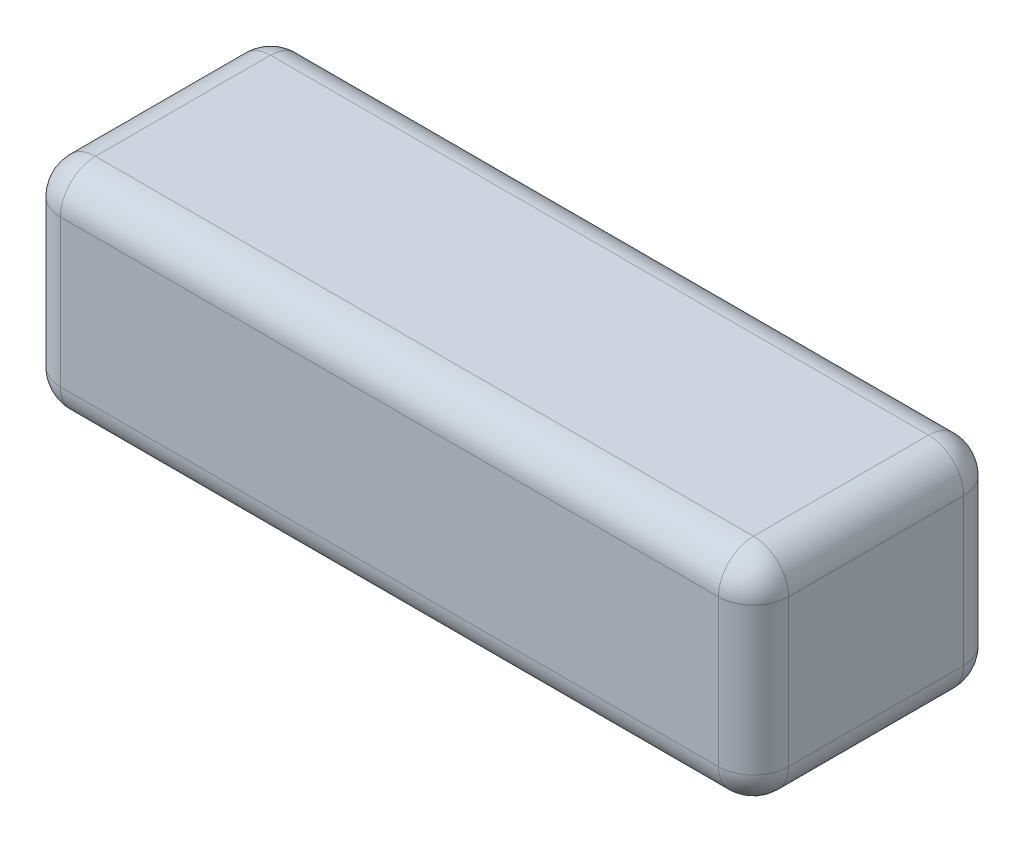
ISO-10303-21;
HEADER;
FILE_DESCRIPTION(('STEP AP214'),'2;1');
FILE_NAME('part.step','',(''),(''),'','','');
FILE_SCHEMA(('AUTOMOTIVE_DESIGN { 1 0 10303 214 1 1 1 1 }'));
ENDSEC;
DATA;
#1=APPLICATION_CONTEXT('core data for automotive mechanical design processes');
#2=APPLICATION_PROTOCOL_DEFINITION('international standard','automotive_design',2000,#1);
#3=PRODUCT_CONTEXT('',#1,'mechanical');
#4=PRODUCT('Part','Part','',(#3));
#5=PRODUCT_RELATED_PRODUCT_CATEGORY('part','',(#4));
#6=PRODUCT_DEFINITION_FORMATION('','',#4);
#7=PRODUCT_DEFINITION_CONTEXT('part definition',#1,'design');
#8=PRODUCT_DEFINITION('design','',#6,#7);
#9=PRODUCT_DEFINITION_SHAPE('','',#8);
#10=(LENGTH_UNIT() NAMED_UNIT(*) SI_UNIT(.MILLI.,.METRE.));
#11=(NAMED_UNIT(*) PLANE_ANGLE_UNIT() SI_UNIT($,.RADIAN.));
#12=(NAMED_UNIT(*) SI_UNIT($,.STERADIAN.) SOLID_ANGLE_UNIT());
#13=UNCERTAINTY_MEASURE_WITH_UNIT(LENGTH_MEASURE(1.E-05),#10,'distance_accuracy_value','');
#14=(GEOMETRIC_REPRESENTATION_CONTEXT(3) GLOBAL_UNCERTAINTY_ASSIGNED_CONTEXT((#13)) GLOBAL_UNIT_ASSIGNED_CONTEXT((#10,
#11,#12)) REPRESENTATION_CONTEXT('',''));
#15=CARTESIAN_POINT('',(0.,0.,0.));
#16=DIRECTION('',(0.,0.,1.));
#17=DIRECTION('',(1.,0.,0.));
#18=AXIS2_PLACEMENT_3D('',#15,#16,#17);
#19=CARTESIAN_POINT('',(51.975,31.,-17.5));
#20=DIRECTION('',(-1.,0.,0.));
#21=DIRECTION('',(0.,0.,1.));
#22=AXIS2_PLACEMENT_3D('',#19,#20,#21);
#23=PLANE('',#22);
#24=DIRECTION('',(0.,-1.,0.));
#25=VECTOR('',#24,1.);
#26=CARTESIAN_POINT('',(51.975,31.,12.5));
#27=LINE('',#26,#25);
#28=CARTESIAN_POINT('',(51.975,26.,12.5));
#29=VERTEX_POINT('',#28);
#30=CARTESIAN_POINT('',(51.975,5.,12.5));
#31=VERTEX_POINT('',#30);
#32=EDGE_CURVE('E278',#29,#31,#27,.T.);
#33=ORIENTED_EDGE('',*,*,#32,.T.);
#34=DIRECTION('',(0.,0.,-1.));
#35=VECTOR('',#34,1.);
#36=CARTESIAN_POINT('',(51.975,5.,-17.5));
#37=LINE('',#36,#35);
#38=CARTESIAN_POINT('',(51.975,5.,-12.5));
#39=VERTEX_POINT('',#38);
#40=EDGE_CURVE('E281',#31,#39,#37,.T.);
#41=ORIENTED_EDGE('',*,*,#40,.T.);
#42=DIRECTION('',(0.,-1.,0.));
#43=VECTOR('',#42,1.);
#44=CARTESIAN_POINT('',(51.975,31.,-12.5));
#45=LINE('',#44,#43);
#46=CARTESIAN_POINT('',(51.975,26.,-12.5));
#47=VERTEX_POINT('',#46);
#48=EDGE_CURVE('E213',#39,#47,#45,.F.);
#49=ORIENTED_EDGE('',*,*,#48,.T.);
#50=DIRECTION('',(0.,0.,-1.));
#51=VECTOR('',#50,1.);
#52=CARTESIAN_POINT('',(51.975,26.,17.5));
#53=LINE('',#52,#51);
#54=EDGE_CURVE('E262',#47,#29,#53,.F.);
#55=ORIENTED_EDGE('',*,*,#54,.T.);
#56=EDGE_LOOP('',(#33,#41,#49,#55));
#57=FACE_BOUND('',#56,.T.);
#58=ADVANCED_FACE('F33',(#57),#23,.F.);
#59=CARTESIAN_POINT('',(-51.975,31.,-17.5));
#60=DIRECTION('',(0.,0.,1.));
#61=DIRECTION('',(1.,0.,0.));
#62=AXIS2_PLACEMENT_3D('',#59,#60,#61);
#63=PLANE('',#62);
#64=DIRECTION('',(0.,-1.,0.));
#65=VECTOR('',#64,1.);
#66=CARTESIAN_POINT('',(46.975,31.,-17.5));
#67=LINE('',#66,#65);
#68=CARTESIAN_POINT('',(46.975,26.,-17.5));
#69=VERTEX_POINT('',#68);
#70=CARTESIAN_POINT('',(46.975,5.,-17.5));
#71=VERTEX_POINT('',#70);
#72=EDGE_CURVE('E216',#69,#71,#67,.T.);
#73=ORIENTED_EDGE('',*,*,#72,.T.);
#74=DIRECTION('',(-1.,0.,0.));
#75=VECTOR('',#74,1.);
#76=CARTESIAN_POINT('',(-51.975,5.,-17.5));
#77=LINE('',#76,#75);
#78=CARTESIAN_POINT('',(-46.975,5.,-17.5));
#79=VERTEX_POINT('',#78);
#80=EDGE_CURVE('E218',#71,#79,#77,.T.);
#81=ORIENTED_EDGE('',*,*,#80,.T.);
#82=DIRECTION('',(0.,-1.,0.));
#83=VECTOR('',#82,1.);
#84=CARTESIAN_POINT('',(-46.975,31.,-17.5));
#85=LINE('',#84,#83);
#86=CARTESIAN_POINT('',(-46.975,26.,-17.5));
#87=VERTEX_POINT('',#86);
#88=EDGE_CURVE('E219',#79,#87,#85,.F.);
#89=ORIENTED_EDGE('',*,*,#88,.T.);
#90=DIRECTION('',(-1.,0.,0.));
#91=VECTOR('',#90,1.);
#92=CARTESIAN_POINT('',(51.975,26.,-17.5));
#93=LINE('',#92,#91);
#94=EDGE_CURVE('E223',#87,#69,#93,.F.);
#95=ORIENTED_EDGE('',*,*,#94,.T.);
#96=EDGE_LOOP('',(#73,#81,#89,#95));
#97=FACE_BOUND('',#96,.T.);
#98=ADVANCED_FACE('F283',(#97),#63,.F.);
#99=CARTESIAN_POINT('',(-51.975,31.,-17.5));
#100=DIRECTION('',(1.,0.,0.));
#101=DIRECTION('',(0.,0.,-1.));
#102=AXIS2_PLACEMENT_3D('',#99,#100,#101);
#103=PLANE('',#102);
#104=DIRECTION('',(0.,-1.,0.));
#105=VECTOR('',#104,1.);
#106=CARTESIAN_POINT('',(-51.975,31.,-12.5));
#107=LINE('',#106,#105);
#108=CARTESIAN_POINT('',(-51.975,26.,-12.5));
#109=VERTEX_POINT('',#108);
#110=CARTESIAN_POINT('',(-51.975,5.,-12.5));
#111=VERTEX_POINT('',#110);
#112=EDGE_CURVE('E131',#109,#111,#107,.T.);
#113=ORIENTED_EDGE('',*,*,#112,.T.);
#114=DIRECTION('',(0.,0.,1.));
#115=VECTOR('',#114,1.);
#116=CARTESIAN_POINT('',(-51.975,5.,-17.5));
#117=LINE('',#116,#115);
#118=CARTESIAN_POINT('',(-51.975,5.,12.5));
#119=VERTEX_POINT('',#118);
#120=EDGE_CURVE('E127',#111,#119,#117,.T.);
#121=ORIENTED_EDGE('',*,*,#120,.T.);
#122=DIRECTION('',(0.,-1.,0.));
#123=VECTOR('',#122,1.);
#124=CARTESIAN_POINT('',(-51.975,31.,12.5));
#125=LINE('',#124,#123);
#126=CARTESIAN_POINT('',(-51.975,26.,12.5));
#127=VERTEX_POINT('',#126);
#128=EDGE_CURVE('E121',#119,#127,#125,.F.);
#129=ORIENTED_EDGE('',*,*,#128,.T.);
#130=DIRECTION('',(0.,0.,1.));
#131=VECTOR('',#130,1.);
#132=CARTESIAN_POINT('',(-51.975,26.,-17.5));
#133=LINE('',#132,#131);
#134=EDGE_CURVE('E124',#127,#109,#133,.F.);
#135=ORIENTED_EDGE('',*,*,#134,.T.);
#136=EDGE_LOOP('',(#113,#121,#129,#135));
#137=FACE_BOUND('',#136,.T.);
#138=ADVANCED_FACE('F123',(#137),#103,.F.);
#139=CARTESIAN_POINT('',(-51.975,31.,17.5));
#140=DIRECTION('',(0.,0.,-1.));
#141=DIRECTION('',(-1.,0.,0.));
#142=AXIS2_PLACEMENT_3D('',#139,#140,#141);
#143=PLANE('',#142);
#144=DIRECTION('',(0.,-1.,0.));
#145=VECTOR('',#144,1.);
#146=CARTESIAN_POINT('',(-46.975,31.,17.5));
#147=LINE('',#146,#145);
#148=CARTESIAN_POINT('',(-46.975,26.,17.5));
#149=VERTEX_POINT('',#148);
#150=CARTESIAN_POINT('',(-46.975,5.,17.5));
#151=VERTEX_POINT('',#150);
#152=EDGE_CURVE('E153',#149,#151,#147,.T.);
#153=ORIENTED_EDGE('',*,*,#152,.T.);
#154=DIRECTION('',(1.,0.,0.));
#155=VECTOR('',#154,1.);
#156=CARTESIAN_POINT('',(-51.975,5.,17.5));
#157=LINE('',#156,#155);
#158=CARTESIAN_POINT('',(46.975,5.,17.5));
#159=VERTEX_POINT('',#158);
#160=EDGE_CURVE('E231',#151,#159,#157,.T.);
#161=ORIENTED_EDGE('',*,*,#160,.T.);
#162=DIRECTION('',(0.,-1.,0.));
#163=VECTOR('',#162,1.);
#164=CARTESIAN_POINT('',(46.975,31.,17.5));
#165=LINE('',#164,#163);
#166=CARTESIAN_POINT('',(46.975,26.,17.5));
#167=VERTEX_POINT('',#166);
#168=EDGE_CURVE('E228',#159,#167,#165,.F.);
#169=ORIENTED_EDGE('',*,*,#168,.T.);
#170=DIRECTION('',(1.,0.,0.));
#171=VECTOR('',#170,1.);
#172=CARTESIAN_POINT('',(-51.975,26.,17.5));
#173=LINE('',#172,#171);
#174=EDGE_CURVE('E221',#167,#149,#173,.F.);
#175=ORIENTED_EDGE('',*,*,#174,.T.);
#176=EDGE_LOOP('',(#153,#161,#169,#175));
#177=FACE_BOUND('',#176,.T.);
#178=ADVANCED_FACE('F337',(#177),#143,.F.);
#179=CARTESIAN_POINT('',(0.,31.,0.));
#180=DIRECTION('',(0.,1.,0.));
#181=DIRECTION('',(0.,0.,1.));
#182=AXIS2_PLACEMENT_3D('',#179,#180,#181);
#183=PLANE('',#182);
#184=DIRECTION('',(0.,0.,1.));
#185=VECTOR('',#184,1.);
#186=CARTESIAN_POINT('',(-46.975,31.,17.5));
#187=LINE('',#186,#185);
#188=CARTESIAN_POINT('',(-46.975,31.,-12.5));
#189=VERTEX_POINT('',#188);
#190=CARTESIAN_POINT('',(-46.975,31.,12.5));
#191=VERTEX_POINT('',#190);
#192=EDGE_CURVE('E42',#189,#191,#187,.T.);
#193=ORIENTED_EDGE('',*,*,#192,.T.);
#194=DIRECTION('',(1.,0.,0.));
#195=VECTOR('',#194,1.);
#196=CARTESIAN_POINT('',(51.975,31.,12.5));
#197=LINE('',#196,#195);
#198=CARTESIAN_POINT('',(46.975,31.,12.5));
#199=VERTEX_POINT('',#198);
#200=EDGE_CURVE('E11',#191,#199,#197,.T.);
#201=ORIENTED_EDGE('',*,*,#200,.T.);
#202=DIRECTION('',(0.,0.,-1.));
#203=VECTOR('',#202,1.);
#204=CARTESIAN_POINT('',(46.975,31.,-17.5));
#205=LINE('',#204,#203);
#206=CARTESIAN_POINT('',(46.975,31.,-12.5));
#207=VERTEX_POINT('',#206);
#208=EDGE_CURVE('E233',#199,#207,#205,.T.);
#209=ORIENTED_EDGE('',*,*,#208,.T.);
#210=DIRECTION('',(-1.,0.,0.));
#211=VECTOR('',#210,1.);
#212=CARTESIAN_POINT('',(-51.975,31.,-12.5));
#213=LINE('',#212,#211);
#214=EDGE_CURVE('E53',#207,#189,#213,.T.);
#215=ORIENTED_EDGE('',*,*,#214,.T.);
#216=EDGE_LOOP('',(#193,#201,#209,#215));
#217=FACE_BOUND('',#216,.T.);
#218=ADVANCED_FACE('F341',(#217),#183,.T.);
#219=CARTESIAN_POINT('',(0.,0.,0.));
#220=DIRECTION('',(0.,1.,0.));
#221=DIRECTION('',(0.,0.,1.));
#222=AXIS2_PLACEMENT_3D('',#219,#220,#221);
#223=PLANE('',#222);
#224=DIRECTION('',(0.,0.,1.));
#225=VECTOR('',#224,1.);
#226=CARTESIAN_POINT('',(-46.975,0.,0.));
#227=LINE('',#226,#225);
#228=CARTESIAN_POINT('',(-46.975,0.,12.5));
#229=VERTEX_POINT('',#228);
#230=CARTESIAN_POINT('',(-46.975,0.,-12.5));
#231=VERTEX_POINT('',#230);
#232=EDGE_CURVE('E263',#229,#231,#227,.F.);
#233=ORIENTED_EDGE('',*,*,#232,.T.);
#234=DIRECTION('',(-1.,0.,0.));
#235=VECTOR('',#234,1.);
#236=CARTESIAN_POINT('',(0.,0.,-12.5));
#237=LINE('',#236,#235);
#238=CARTESIAN_POINT('',(46.975,0.,-12.5));
#239=VERTEX_POINT('',#238);
#240=EDGE_CURVE('E256',#231,#239,#237,.F.);
#241=ORIENTED_EDGE('',*,*,#240,.T.);
#242=DIRECTION('',(0.,0.,-1.));
#243=VECTOR('',#242,1.);
#244=CARTESIAN_POINT('',(46.975,0.,0.));
#245=LINE('',#244,#243);
#246=CARTESIAN_POINT('',(46.975,0.,12.5));
#247=VERTEX_POINT('',#246);
#248=EDGE_CURVE('E272',#239,#247,#245,.F.);
#249=ORIENTED_EDGE('',*,*,#248,.T.);
#250=DIRECTION('',(1.,0.,0.));
#251=VECTOR('',#250,1.);
#252=CARTESIAN_POINT('',(0.,0.,12.5));
#253=LINE('',#252,#251);
#254=EDGE_CURVE('E268',#247,#229,#253,.F.);
#255=ORIENTED_EDGE('',*,*,#254,.T.);
#256=EDGE_LOOP('',(#233,#241,#249,#255));
#257=FACE_BOUND('',#256,.T.);
#258=ADVANCED_FACE('F266',(#257),#223,.F.);
#259=CARTESIAN_POINT('',(46.975,26.,0.));
#260=DIRECTION('',(0.,0.,1.));
#261=DIRECTION('',(1.,0.,0.));
#262=AXIS2_PLACEMENT_3D('',#259,#260,#261);
#263=CYLINDRICAL_SURFACE('',#262,5.);
#264=CARTESIAN_POINT('',(46.975,26.,-12.5));
#265=DIRECTION('',(0.,0.,-1.));
#266=DIRECTION('',(-1.,0.,0.));
#267=AXIS2_PLACEMENT_3D('',#264,#265,#266);
#268=CIRCLE('',#267,5.);
#269=EDGE_CURVE('E37',#207,#47,#268,.T.);
#270=ORIENTED_EDGE('',*,*,#269,.F.);
#271=ORIENTED_EDGE('',*,*,#208,.F.);
#272=CARTESIAN_POINT('',(46.975,26.,12.5));
#273=DIRECTION('',(0.,0.,1.));
#274=DIRECTION('',(1.,0.,0.));
#275=AXIS2_PLACEMENT_3D('',#272,#273,#274);
#276=CIRCLE('',#275,5.);
#277=EDGE_CURVE('E193',#29,#199,#276,.T.);
#278=ORIENTED_EDGE('',*,*,#277,.F.);
#279=ORIENTED_EDGE('',*,*,#54,.F.);
#280=EDGE_LOOP('',(#270,#271,#278,#279));
#281=FACE_BOUND('',#280,.T.);
#282=ADVANCED_FACE('F35',(#281),#263,.T.);
#283=CARTESIAN_POINT('',(46.975,26.,-12.5));
#284=DIRECTION('',(0.,0.,1.));
#285=DIRECTION('',(1.,0.,0.));
#286=AXIS2_PLACEMENT_3D('',#283,#284,#285);
#287=SPHERICAL_SURFACE('',#286,5.);
#288=CARTESIAN_POINT('',(46.975,26.,-12.5));
#289=DIRECTION('',(1.,0.,0.));
#290=DIRECTION('',(0.,1.,0.));
#291=AXIS2_PLACEMENT_3D('',#288,#289,#290);
#292=CIRCLE('',#291,5.);
#293=EDGE_CURVE('E188',#207,#69,#292,.F.);
#294=ORIENTED_EDGE('',*,*,#293,.F.);
#295=ORIENTED_EDGE('',*,*,#269,.T.);
#296=CARTESIAN_POINT('',(46.975,26.,-12.5));
#297=DIRECTION('',(0.,1.,0.));
#298=DIRECTION('',(0.,0.,1.));
#299=AXIS2_PLACEMENT_3D('',#296,#297,#298);
#300=CIRCLE('',#299,5.);
#301=EDGE_CURVE('E191',#69,#47,#300,.F.);
#302=ORIENTED_EDGE('',*,*,#301,.F.);
#303=EDGE_LOOP('',(#294,#295,#302));
#304=FACE_BOUND('',#303,.T.);
#305=ADVANCED_FACE('F205',(#304),#287,.T.);
#306=CARTESIAN_POINT('',(46.975,26.,12.5));
#307=DIRECTION('',(0.,0.,1.));
#308=DIRECTION('',(1.,0.,0.));
#309=AXIS2_PLACEMENT_3D('',#306,#307,#308);
#310=SPHERICAL_SURFACE('',#309,5.);
#311=CARTESIAN_POINT('',(46.975,26.,12.5));
#312=DIRECTION('',(0.,1.,0.));
#313=DIRECTION('',(0.,0.,1.));
#314=AXIS2_PLACEMENT_3D('',#311,#312,#313);
#315=CIRCLE('',#314,5.);
#316=EDGE_CURVE('E183',#29,#167,#315,.F.);
#317=ORIENTED_EDGE('',*,*,#316,.F.);
#318=ORIENTED_EDGE('',*,*,#277,.T.);
#319=CARTESIAN_POINT('',(46.975,26.,12.5));
#320=DIRECTION('',(1.,0.,0.));
#321=DIRECTION('',(0.,0.,-1.));
#322=AXIS2_PLACEMENT_3D('',#319,#320,#321);
#323=CIRCLE('',#322,5.);
#324=EDGE_CURVE('E186',#167,#199,#323,.F.);
#325=ORIENTED_EDGE('',*,*,#324,.F.);
#326=EDGE_LOOP('',(#317,#318,#325));
#327=FACE_BOUND('',#326,.T.);
#328=ADVANCED_FACE('F342',(#327),#310,.T.);
#329=CARTESIAN_POINT('',(46.975,31.,-12.5));
#330=DIRECTION('',(0.,-1.,0.));
#331=DIRECTION('',(0.,0.,-1.));
#332=AXIS2_PLACEMENT_3D('',#329,#330,#331);
#333=CYLINDRICAL_SURFACE('',#332,5.);
#334=ORIENTED_EDGE('',*,*,#301,.T.);
#335=ORIENTED_EDGE('',*,*,#48,.F.);
#336=CARTESIAN_POINT('',(46.975,5.,-12.5));
#337=DIRECTION('',(0.,-1.,0.));
#338=DIRECTION('',(0.,0.,-1.));
#339=AXIS2_PLACEMENT_3D('',#336,#337,#338);
#340=CIRCLE('',#339,5.);
#341=EDGE_CURVE('E178',#71,#39,#340,.T.);
#342=ORIENTED_EDGE('',*,*,#341,.F.);
#343=ORIENTED_EDGE('',*,*,#72,.F.);
#344=EDGE_LOOP('',(#334,#335,#342,#343));
#345=FACE_BOUND('',#344,.T.);
#346=ADVANCED_FACE('F211',(#345),#333,.T.);
#347=CARTESIAN_POINT('',(0.,26.,-12.5));
#348=DIRECTION('',(1.,0.,0.));
#349=DIRECTION('',(0.,0.,-1.));
#350=AXIS2_PLACEMENT_3D('',#347,#348,#349);
#351=CYLINDRICAL_SURFACE('',#350,5.);
#352=ORIENTED_EDGE('',*,*,#293,.T.);
#353=ORIENTED_EDGE('',*,*,#94,.F.);
#354=CARTESIAN_POINT('',(-46.975,26.,-12.5));
#355=DIRECTION('',(-1.,0.,0.));
#356=DIRECTION('',(0.,0.,1.));
#357=AXIS2_PLACEMENT_3D('',#354,#355,#356);
#358=CIRCLE('',#357,5.);
#359=EDGE_CURVE('E175',#189,#87,#358,.T.);
#360=ORIENTED_EDGE('',*,*,#359,.F.);
#361=ORIENTED_EDGE('',*,*,#214,.F.);
#362=EDGE_LOOP('',(#352,#353,#360,#361));
#363=FACE_BOUND('',#362,.T.);
#364=ADVANCED_FACE('F287',(#363),#351,.T.);
#365=CARTESIAN_POINT('',(-46.975,26.,0.));
#366=DIRECTION('',(0.,0.,-1.));
#367=DIRECTION('',(-1.,0.,0.));
#368=AXIS2_PLACEMENT_3D('',#365,#366,#367);
#369=CYLINDRICAL_SURFACE('',#368,5.);
#370=CARTESIAN_POINT('',(-46.975,26.,12.5));
#371=DIRECTION('',(0.,0.,1.));
#372=DIRECTION('',(1.,0.,0.));
#373=AXIS2_PLACEMENT_3D('',#370,#371,#372);
#374=CIRCLE('',#373,5.);
#375=EDGE_CURVE('E137',#191,#127,#374,.T.);
#376=ORIENTED_EDGE('',*,*,#375,.F.);
#377=ORIENTED_EDGE('',*,*,#192,.F.);
#378=CARTESIAN_POINT('',(-46.975,26.,-12.5));
#379=DIRECTION('',(0.,0.,-1.));
#380=DIRECTION('',(-1.,0.,0.));
#381=AXIS2_PLACEMENT_3D('',#378,#379,#380);
#382=CIRCLE('',#381,5.);
#383=EDGE_CURVE('E140',#109,#189,#382,.T.);
#384=ORIENTED_EDGE('',*,*,#383,.F.);
#385=ORIENTED_EDGE('',*,*,#134,.F.);
#386=EDGE_LOOP('',(#376,#377,#384,#385));
#387=FACE_BOUND('',#386,.T.);
#388=ADVANCED_FACE('F136',(#387),#369,.T.);
#389=CARTESIAN_POINT('',(0.,26.,12.5));
#390=DIRECTION('',(-1.,0.,0.));
#391=DIRECTION('',(0.,0.,1.));
#392=AXIS2_PLACEMENT_3D('',#389,#390,#391);
#393=CYLINDRICAL_SURFACE('',#392,5.);
#394=ORIENTED_EDGE('',*,*,#324,.T.);
#395=ORIENTED_EDGE('',*,*,#200,.F.);
#396=CARTESIAN_POINT('',(-46.975,26.,12.5));
#397=DIRECTION('',(-1.,0.,0.));
#398=DIRECTION('',(0.,0.,1.));
#399=AXIS2_PLACEMENT_3D('',#396,#397,#398);
#400=CIRCLE('',#399,5.);
#401=EDGE_CURVE('E149',#149,#191,#400,.T.);
#402=ORIENTED_EDGE('',*,*,#401,.F.);
#403=ORIENTED_EDGE('',*,*,#174,.F.);
#404=EDGE_LOOP('',(#394,#395,#402,#403));
#405=FACE_BOUND('',#404,.T.);
#406=ADVANCED_FACE('F340',(#405),#393,.T.);
#407=CARTESIAN_POINT('',(46.975,31.,12.5));
#408=DIRECTION('',(0.,-1.,0.));
#409=DIRECTION('',(0.,0.,-1.));
#410=AXIS2_PLACEMENT_3D('',#407,#408,#409);
#411=CYLINDRICAL_SURFACE('',#410,5.);
#412=ORIENTED_EDGE('',*,*,#316,.T.);
#413=ORIENTED_EDGE('',*,*,#168,.F.);
#414=CARTESIAN_POINT('',(46.975,5.,12.5));
#415=DIRECTION('',(0.,-1.,0.));
#416=DIRECTION('',(0.,0.,-1.));
#417=AXIS2_PLACEMENT_3D('',#414,#415,#416);
#418=CIRCLE('',#417,5.);
#419=EDGE_CURVE('E170',#31,#159,#418,.T.);
#420=ORIENTED_EDGE('',*,*,#419,.F.);
#421=ORIENTED_EDGE('',*,*,#32,.F.);
#422=EDGE_LOOP('',(#412,#413,#420,#421));
#423=FACE_BOUND('',#422,.T.);
#424=ADVANCED_FACE('F335',(#423),#411,.T.);
#425=CARTESIAN_POINT('',(46.975,5.,-17.5));
#426=DIRECTION('',(0.,0.,-1.));
#427=DIRECTION('',(-1.,0.,0.));
#428=AXIS2_PLACEMENT_3D('',#425,#426,#427);
#429=CYLINDRICAL_SURFACE('',#428,5.);
#430=CARTESIAN_POINT('',(46.975,5.,-12.5));
#431=DIRECTION('',(0.,0.,-1.));
#432=DIRECTION('',(-1.,0.,0.));
#433=AXIS2_PLACEMENT_3D('',#430,#431,#432);
#434=CIRCLE('',#433,5.);
#435=EDGE_CURVE('E180',#39,#239,#434,.T.);
#436=ORIENTED_EDGE('',*,*,#435,.F.);
#437=ORIENTED_EDGE('',*,*,#40,.F.);
#438=CARTESIAN_POINT('',(46.975,5.,12.5));
#439=DIRECTION('',(0.,0.,1.));
#440=DIRECTION('',(1.,0.,0.));
#441=AXIS2_PLACEMENT_3D('',#438,#439,#440);
#442=CIRCLE('',#441,5.);
#443=EDGE_CURVE('E167',#247,#31,#442,.T.);
#444=ORIENTED_EDGE('',*,*,#443,.F.);
#445=ORIENTED_EDGE('',*,*,#248,.F.);
#446=EDGE_LOOP('',(#436,#437,#444,#445));
#447=FACE_BOUND('',#446,.T.);
#448=ADVANCED_FACE('F359',(#447),#429,.T.);
#449=CARTESIAN_POINT('',(46.975,5.,-12.5));
#450=DIRECTION('',(0.,0.,1.));
#451=DIRECTION('',(1.,0.,0.));
#452=AXIS2_PLACEMENT_3D('',#449,#450,#451);
#453=SPHERICAL_SURFACE('',#452,5.);
#454=ORIENTED_EDGE('',*,*,#341,.T.);
#455=ORIENTED_EDGE('',*,*,#435,.T.);
#456=CARTESIAN_POINT('',(46.975,5.,-12.5));
#457=DIRECTION('',(1.,0.,0.));
#458=DIRECTION('',(0.,0.,-1.));
#459=AXIS2_PLACEMENT_3D('',#456,#457,#458);
#460=CIRCLE('',#459,5.);
#461=EDGE_CURVE('E158',#71,#239,#460,.F.);
#462=ORIENTED_EDGE('',*,*,#461,.F.);
#463=EDGE_LOOP('',(#454,#455,#462));
#464=FACE_BOUND('',#463,.T.);
#465=ADVANCED_FACE('F362',(#464),#453,.T.);
#466=CARTESIAN_POINT('',(-46.975,26.,-12.5));
#467=DIRECTION('',(0.,0.,1.));
#468=DIRECTION('',(1.,0.,0.));
#469=AXIS2_PLACEMENT_3D('',#466,#467,#468);
#470=SPHERICAL_SURFACE('',#469,5.);
#471=ORIENTED_EDGE('',*,*,#383,.T.);
#472=ORIENTED_EDGE('',*,*,#359,.T.);
#473=CARTESIAN_POINT('',(-46.975,26.,-12.5));
#474=DIRECTION('',(0.,1.,0.));
#475=DIRECTION('',(0.,0.,1.));
#476=AXIS2_PLACEMENT_3D('',#473,#474,#475);
#477=CIRCLE('',#476,5.);
#478=EDGE_CURVE('E154',#109,#87,#477,.F.);
#479=ORIENTED_EDGE('',*,*,#478,.F.);
#480=EDGE_LOOP('',(#471,#472,#479));
#481=FACE_BOUND('',#480,.T.);
#482=ADVANCED_FACE('F289',(#481),#470,.T.);
#483=CARTESIAN_POINT('',(-46.975,26.,12.5));
#484=DIRECTION('',(0.,0.,1.));
#485=DIRECTION('',(1.,0.,0.));
#486=AXIS2_PLACEMENT_3D('',#483,#484,#485);
#487=SPHERICAL_SURFACE('',#486,5.);
#488=ORIENTED_EDGE('',*,*,#401,.T.);
#489=ORIENTED_EDGE('',*,*,#375,.T.);
#490=CARTESIAN_POINT('',(-46.975,26.,12.5));
#491=DIRECTION('',(0.,1.,0.));
#492=DIRECTION('',(0.,0.,1.));
#493=AXIS2_PLACEMENT_3D('',#490,#491,#492);
#494=CIRCLE('',#493,5.);
#495=EDGE_CURVE('E146',#149,#127,#494,.F.);
#496=ORIENTED_EDGE('',*,*,#495,.F.);
#497=EDGE_LOOP('',(#488,#489,#496));
#498=FACE_BOUND('',#497,.T.);
#499=ADVANCED_FACE('F145',(#498),#487,.T.);
#500=CARTESIAN_POINT('',(46.975,5.,12.5));
#501=DIRECTION('',(0.,0.,1.));
#502=DIRECTION('',(1.,0.,0.));
#503=AXIS2_PLACEMENT_3D('',#500,#501,#502);
#504=SPHERICAL_SURFACE('',#503,5.);
#505=ORIENTED_EDGE('',*,*,#443,.T.);
#506=ORIENTED_EDGE('',*,*,#419,.T.);
#507=CARTESIAN_POINT('',(46.975,5.,12.5));
#508=DIRECTION('',(1.,0.,0.));
#509=DIRECTION('',(0.,0.,-1.));
#510=AXIS2_PLACEMENT_3D('',#507,#508,#509);
#511=CIRCLE('',#510,5.);
#512=EDGE_CURVE('E155',#247,#159,#511,.F.);
#513=ORIENTED_EDGE('',*,*,#512,.F.);
#514=EDGE_LOOP('',(#505,#506,#513));
#515=FACE_BOUND('',#514,.T.);
#516=ADVANCED_FACE('F303',(#515),#504,.T.);
#517=CARTESIAN_POINT('',(-51.975,5.,-12.5));
#518=DIRECTION('',(-1.,0.,0.));
#519=DIRECTION('',(0.,0.,1.));
#520=AXIS2_PLACEMENT_3D('',#517,#518,#519);
#521=CYLINDRICAL_SURFACE('',#520,5.);
#522=ORIENTED_EDGE('',*,*,#461,.T.);
#523=ORIENTED_EDGE('',*,*,#240,.F.);
#524=CARTESIAN_POINT('',(-46.975,5.,-12.5));
#525=DIRECTION('',(-1.,0.,0.));
#526=DIRECTION('',(0.,0.,1.));
#527=AXIS2_PLACEMENT_3D('',#524,#525,#526);
#528=CIRCLE('',#527,5.);
#529=EDGE_CURVE('E161',#79,#231,#528,.T.);
#530=ORIENTED_EDGE('',*,*,#529,.F.);
#531=ORIENTED_EDGE('',*,*,#80,.F.);
#532=EDGE_LOOP('',(#522,#523,#530,#531));
#533=FACE_BOUND('',#532,.T.);
#534=ADVANCED_FACE('F258',(#533),#521,.T.);
#535=CARTESIAN_POINT('',(-46.975,31.,-12.5));
#536=DIRECTION('',(0.,-1.,0.));
#537=DIRECTION('',(0.,0.,-1.));
#538=AXIS2_PLACEMENT_3D('',#535,#536,#537);
#539=CYLINDRICAL_SURFACE('',#538,5.);
#540=ORIENTED_EDGE('',*,*,#478,.T.);
#541=ORIENTED_EDGE('',*,*,#88,.F.);
#542=CARTESIAN_POINT('',(-46.975,5.,-12.5));
#543=DIRECTION('',(0.,-1.,0.));
#544=DIRECTION('',(0.,0.,-1.));
#545=AXIS2_PLACEMENT_3D('',#542,#543,#544);
#546=CIRCLE('',#545,5.);
#547=EDGE_CURVE('E246',#111,#79,#546,.T.);
#548=ORIENTED_EDGE('',*,*,#547,.F.);
#549=ORIENTED_EDGE('',*,*,#112,.F.);
#550=EDGE_LOOP('',(#540,#541,#548,#549));
#551=FACE_BOUND('',#550,.T.);
#552=ADVANCED_FACE('F292',(#551),#539,.T.);
#553=CARTESIAN_POINT('',(-46.975,31.,12.5));
#554=DIRECTION('',(0.,-1.,0.));
#555=DIRECTION('',(0.,0.,-1.));
#556=AXIS2_PLACEMENT_3D('',#553,#554,#555);
#557=CYLINDRICAL_SURFACE('',#556,5.);
#558=ORIENTED_EDGE('',*,*,#495,.T.);
#559=ORIENTED_EDGE('',*,*,#128,.F.);
#560=CARTESIAN_POINT('',(-46.975,5.,12.5));
#561=DIRECTION('',(0.,-1.,0.));
#562=DIRECTION('',(0.,0.,-1.));
#563=AXIS2_PLACEMENT_3D('',#560,#561,#562);
#564=CIRCLE('',#563,5.);
#565=EDGE_CURVE('E243',#151,#119,#564,.T.);
#566=ORIENTED_EDGE('',*,*,#565,.F.);
#567=ORIENTED_EDGE('',*,*,#152,.F.);
#568=EDGE_LOOP('',(#558,#559,#566,#567));
#569=FACE_BOUND('',#568,.T.);
#570=ADVANCED_FACE('F151',(#569),#557,.T.);
#571=CARTESIAN_POINT('',(-51.975,5.,12.5));
#572=DIRECTION('',(1.,0.,0.));
#573=DIRECTION('',(0.,0.,-1.));
#574=AXIS2_PLACEMENT_3D('',#571,#572,#573);
#575=CYLINDRICAL_SURFACE('',#574,5.);
#576=ORIENTED_EDGE('',*,*,#512,.T.);
#577=ORIENTED_EDGE('',*,*,#160,.F.);
#578=CARTESIAN_POINT('',(-46.975,5.,12.5));
#579=DIRECTION('',(-1.,0.,0.));
#580=DIRECTION('',(0.,0.,1.));
#581=AXIS2_PLACEMENT_3D('',#578,#579,#580);
#582=CIRCLE('',#581,5.);
#583=EDGE_CURVE('E241',#229,#151,#582,.T.);
#584=ORIENTED_EDGE('',*,*,#583,.F.);
#585=ORIENTED_EDGE('',*,*,#254,.F.);
#586=EDGE_LOOP('',(#576,#577,#584,#585));
#587=FACE_BOUND('',#586,.T.);
#588=ADVANCED_FACE('F301',(#587),#575,.T.);
#589=CARTESIAN_POINT('',(-46.975,5.,-12.5));
#590=DIRECTION('',(0.,0.,1.));
#591=DIRECTION('',(1.,0.,0.));
#592=AXIS2_PLACEMENT_3D('',#589,#590,#591);
#593=SPHERICAL_SURFACE('',#592,5.);
#594=ORIENTED_EDGE('',*,*,#547,.T.);
#595=ORIENTED_EDGE('',*,*,#529,.T.);
#596=CARTESIAN_POINT('',(-46.975,5.,-12.5));
#597=DIRECTION('',(0.,0.,-1.));
#598=DIRECTION('',(-1.,0.,0.));
#599=AXIS2_PLACEMENT_3D('',#596,#597,#598);
#600=CIRCLE('',#599,5.);
#601=EDGE_CURVE('E239',#111,#231,#600,.F.);
#602=ORIENTED_EDGE('',*,*,#601,.F.);
#603=EDGE_LOOP('',(#594,#595,#602));
#604=FACE_BOUND('',#603,.T.);
#605=ADVANCED_FACE('F253',(#604),#593,.T.);
#606=CARTESIAN_POINT('',(-46.975,5.,12.5));
#607=DIRECTION('',(0.,0.,1.));
#608=DIRECTION('',(1.,0.,0.));
#609=AXIS2_PLACEMENT_3D('',#606,#607,#608);
#610=SPHERICAL_SURFACE('',#609,5.);
#611=ORIENTED_EDGE('',*,*,#583,.T.);
#612=ORIENTED_EDGE('',*,*,#565,.T.);
#613=CARTESIAN_POINT('',(-46.975,5.,12.5));
#614=DIRECTION('',(0.,0.,1.));
#615=DIRECTION('',(1.,0.,0.));
#616=AXIS2_PLACEMENT_3D('',#613,#614,#615);
#617=CIRCLE('',#616,5.);
#618=EDGE_CURVE('E237',#229,#119,#617,.F.);
#619=ORIENTED_EDGE('',*,*,#618,.F.);
#620=EDGE_LOOP('',(#611,#612,#619));
#621=FACE_BOUND('',#620,.T.);
#622=ADVANCED_FACE('F317',(#621),#610,.T.);
#623=CARTESIAN_POINT('',(-46.975,5.,-17.5));
#624=DIRECTION('',(0.,0.,1.));
#625=DIRECTION('',(1.,0.,0.));
#626=AXIS2_PLACEMENT_3D('',#623,#624,#625);
#627=CYLINDRICAL_SURFACE('',#626,5.);
#628=ORIENTED_EDGE('',*,*,#601,.T.);
#629=ORIENTED_EDGE('',*,*,#232,.F.);
#630=ORIENTED_EDGE('',*,*,#618,.T.);
#631=ORIENTED_EDGE('',*,*,#120,.F.);
#632=EDGE_LOOP('',(#628,#629,#630,#631));
#633=FACE_BOUND('',#632,.T.);
#634=ADVANCED_FACE('F314',(#633),#627,.T.);
#635=CLOSED_SHELL('',(#58,#98,#138,#178,#218,#258,#282,#305,#328,#346,#364,#388,#406,#424,#448,
#465,#482,#499,#516,#534,#552,#570,#588,#605,#622,#634));
#636=MANIFOLD_SOLID_BREP('B2',#635);
#637=ADVANCED_BREP_SHAPE_REPRESENTATION('',(#18,#636),#14);
#638=SHAPE_DEFINITION_REPRESENTATION(#9,#637);
ENDSEC;
END-ISO-10303-21;
